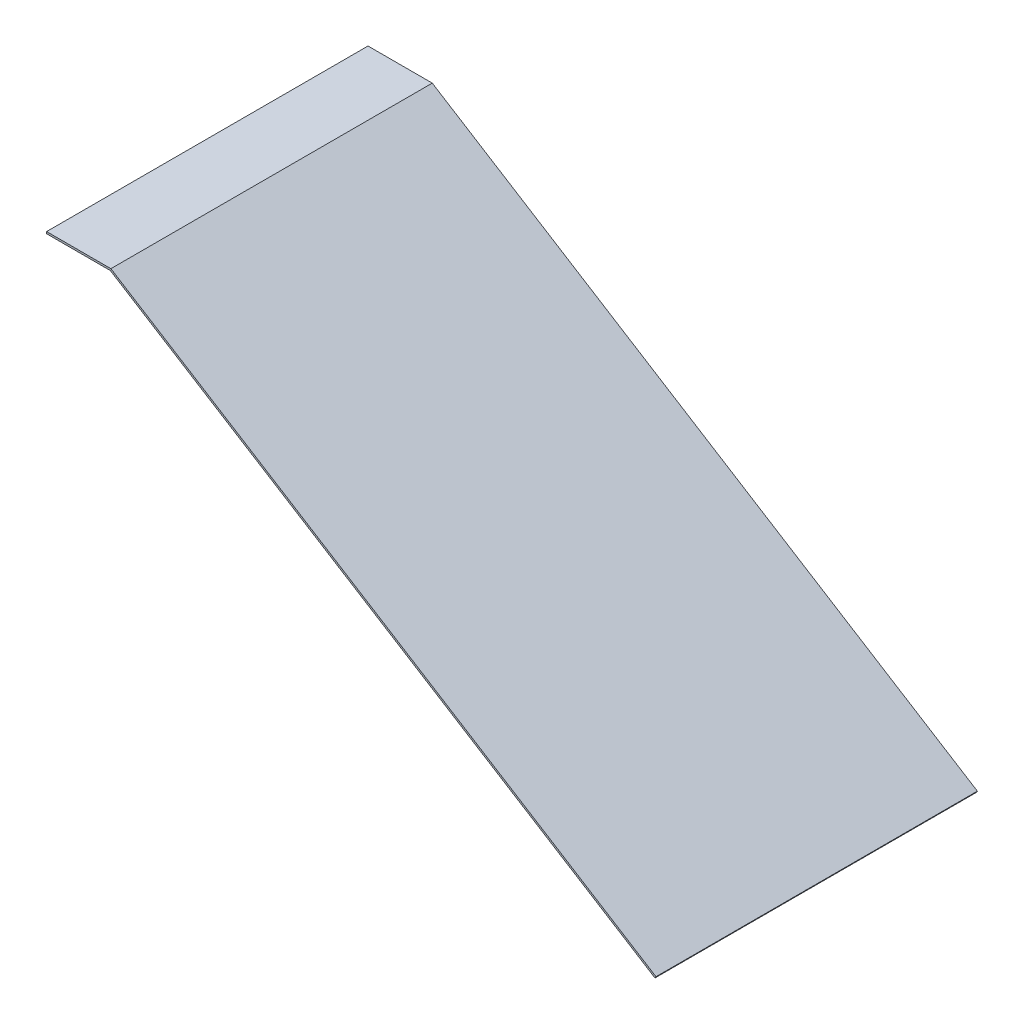
ISO-10303-21;
HEADER;
FILE_DESCRIPTION(('STEP AP214'),'2;1');
FILE_NAME('part.step','',(''),(''),'','','');
FILE_SCHEMA(('AUTOMOTIVE_DESIGN { 1 0 10303 214 1 1 1 1 }'));
ENDSEC;
DATA;
#1=APPLICATION_CONTEXT('core data for automotive mechanical design processes');
#2=APPLICATION_PROTOCOL_DEFINITION('international standard','automotive_design',2000,#1);
#3=PRODUCT_CONTEXT('',#1,'mechanical');
#4=PRODUCT('Part','Part','',(#3));
#5=PRODUCT_RELATED_PRODUCT_CATEGORY('part','',(#4));
#6=PRODUCT_DEFINITION_FORMATION('','',#4);
#7=PRODUCT_DEFINITION_CONTEXT('part definition',#1,'design');
#8=PRODUCT_DEFINITION('design','',#6,#7);
#9=PRODUCT_DEFINITION_SHAPE('','',#8);
#10=(LENGTH_UNIT() NAMED_UNIT(*) SI_UNIT(.MILLI.,.METRE.));
#11=(NAMED_UNIT(*) PLANE_ANGLE_UNIT() SI_UNIT($,.RADIAN.));
#12=(NAMED_UNIT(*) SI_UNIT($,.STERADIAN.) SOLID_ANGLE_UNIT());
#13=UNCERTAINTY_MEASURE_WITH_UNIT(LENGTH_MEASURE(1.E-05),#10,'distance_accuracy_value','');
#14=(GEOMETRIC_REPRESENTATION_CONTEXT(3) GLOBAL_UNCERTAINTY_ASSIGNED_CONTEXT((#13)) GLOBAL_UNIT_ASSIGNED_CONTEXT((#10,
#11,#12)) REPRESENTATION_CONTEXT('',''));
#15=CARTESIAN_POINT('',(0.,0.,0.));
#16=DIRECTION('',(0.,0.,1.));
#17=DIRECTION('',(1.,0.,0.));
#18=AXIS2_PLACEMENT_3D('',#15,#16,#17);
#19=CARTESIAN_POINT('',(50.,559.752128098721,500.));
#20=DIRECTION('',(1.,0.,0.));
#21=DIRECTION('',(0.,0.,-1.));
#22=AXIS2_PLACEMENT_3D('',#19,#20,#21);
#23=PLANE('',#22);
#24=DIRECTION('',(0.,-1.,0.));
#25=VECTOR('',#24,1.);
#26=CARTESIAN_POINT('',(50.,559.752128098721,0.));
#27=LINE('',#26,#25);
#28=CARTESIAN_POINT('',(50.,562.752128098721,0.));
#29=VERTEX_POINT('',#28);
#30=CARTESIAN_POINT('',(50.,559.752128098721,0.));
#31=VERTEX_POINT('',#30);
#32=EDGE_CURVE('E133',#29,#31,#27,.T.);
#33=ORIENTED_EDGE('',*,*,#32,.T.);
#34=DIRECTION('',(0.,0.,-1.));
#35=VECTOR('',#34,1.);
#36=CARTESIAN_POINT('',(50.,559.752128098721,500.));
#37=LINE('',#36,#35);
#38=CARTESIAN_POINT('',(50.,559.752128098721,500.));
#39=VERTEX_POINT('',#38);
#40=EDGE_CURVE('E11',#39,#31,#37,.T.);
#41=ORIENTED_EDGE('',*,*,#40,.F.);
#42=DIRECTION('',(0.,-1.,0.));
#43=VECTOR('',#42,1.);
#44=CARTESIAN_POINT('',(50.,559.752128098721,500.));
#45=LINE('',#44,#43);
#46=CARTESIAN_POINT('',(50.,562.752128098721,500.));
#47=VERTEX_POINT('',#46);
#48=EDGE_CURVE('E145',#47,#39,#45,.T.);
#49=ORIENTED_EDGE('',*,*,#48,.F.);
#50=DIRECTION('',(0.,0.,-1.));
#51=VECTOR('',#50,1.);
#52=CARTESIAN_POINT('',(50.,562.752128098721,500.));
#53=LINE('',#52,#51);
#54=EDGE_CURVE('E129',#47,#29,#53,.T.);
#55=ORIENTED_EDGE('',*,*,#54,.T.);
#56=EDGE_LOOP('',(#33,#41,#49,#55));
#57=FACE_BOUND('',#56,.T.);
#58=ADVANCED_FACE('F43',(#57),#23,.F.);
#59=CARTESIAN_POINT('',(150.,559.752128098721,500.));
#60=DIRECTION('',(0.,1.,0.));
#61=DIRECTION('',(0.,0.,1.));
#62=AXIS2_PLACEMENT_3D('',#59,#60,#61);
#63=PLANE('',#62);
#64=DIRECTION('',(1.,0.,0.));
#65=VECTOR('',#64,1.);
#66=CARTESIAN_POINT('',(150.,559.752128098721,0.));
#67=LINE('',#66,#65);
#68=CARTESIAN_POINT('',(150.,559.752128098721,0.));
#69=VERTEX_POINT('',#68);
#70=EDGE_CURVE('E136',#31,#69,#67,.T.);
#71=ORIENTED_EDGE('',*,*,#70,.T.);
#72=DIRECTION('',(0.,0.,-1.));
#73=VECTOR('',#72,1.);
#74=CARTESIAN_POINT('',(150.,559.752128098721,500.));
#75=LINE('',#74,#73);
#76=CARTESIAN_POINT('',(150.,559.752128098721,500.));
#77=VERTEX_POINT('',#76);
#78=EDGE_CURVE('E51',#77,#69,#75,.T.);
#79=ORIENTED_EDGE('',*,*,#78,.F.);
#80=DIRECTION('',(1.,0.,0.));
#81=VECTOR('',#80,1.);
#82=CARTESIAN_POINT('',(150.,559.752128098721,500.));
#83=LINE('',#82,#81);
#84=EDGE_CURVE('E99',#39,#77,#83,.T.);
#85=ORIENTED_EDGE('',*,*,#84,.F.);
#86=ORIENTED_EDGE('',*,*,#40,.T.);
#87=EDGE_LOOP('',(#71,#79,#85,#86));
#88=FACE_BOUND('',#87,.T.);
#89=ADVANCED_FACE('F170',(#88),#63,.F.);
#90=CARTESIAN_POINT('',(150.,559.214592888635,500.));
#91=DIRECTION('',(1.,0.,0.));
#92=DIRECTION('',(0.,0.,-1.));
#93=AXIS2_PLACEMENT_3D('',#90,#91,#92);
#94=PLANE('',#93);
#95=DIRECTION('',(0.,-1.,0.));
#96=VECTOR('',#95,1.);
#97=CARTESIAN_POINT('',(150.,559.214592888635,0.));
#98=LINE('',#97,#96);
#99=CARTESIAN_POINT('',(150.,559.214592888635,0.));
#100=VERTEX_POINT('',#99);
#101=EDGE_CURVE('E138',#69,#100,#98,.T.);
#102=ORIENTED_EDGE('',*,*,#101,.T.);
#103=DIRECTION('',(0.,0.,-1.));
#104=VECTOR('',#103,1.);
#105=CARTESIAN_POINT('',(150.,559.214592888635,500.));
#106=LINE('',#105,#104);
#107=CARTESIAN_POINT('',(150.,559.214592888635,500.));
#108=VERTEX_POINT('',#107);
#109=EDGE_CURVE('E149',#108,#100,#106,.T.);
#110=ORIENTED_EDGE('',*,*,#109,.F.);
#111=DIRECTION('',(0.,-1.,0.));
#112=VECTOR('',#111,1.);
#113=CARTESIAN_POINT('',(150.,559.214592888635,500.));
#114=LINE('',#113,#112);
#115=EDGE_CURVE('E157',#77,#108,#114,.T.);
#116=ORIENTED_EDGE('',*,*,#115,.F.);
#117=ORIENTED_EDGE('',*,*,#78,.T.);
#118=EDGE_LOOP('',(#102,#110,#116,#117));
#119=FACE_BOUND('',#118,.T.);
#120=ADVANCED_FACE('F155',(#119),#94,.F.);
#121=CARTESIAN_POINT('',(996.458338363726,30.2887195770469,500.));
#122=DIRECTION('',(0.529919264233205,0.848048096156426,0.));
#123=DIRECTION('',(-0.848048096156426,0.529919264233205,0.));
#124=AXIS2_PLACEMENT_3D('',#121,#122,#123);
#125=PLANE('',#124);
#126=DIRECTION('',(0.848048096156426,-0.529919264233205,0.));
#127=VECTOR('',#126,1.);
#128=CARTESIAN_POINT('',(996.458338363726,30.2887195770469,0.));
#129=LINE('',#128,#127);
#130=CARTESIAN_POINT('',(996.458338363726,30.2887195770469,0.));
#131=VERTEX_POINT('',#130);
#132=EDGE_CURVE('E140',#100,#131,#129,.T.);
#133=ORIENTED_EDGE('',*,*,#132,.T.);
#134=DIRECTION('',(0.,0.,-1.));
#135=VECTOR('',#134,1.);
#136=CARTESIAN_POINT('',(996.458338363726,30.2887195770469,500.));
#137=LINE('',#136,#135);
#138=CARTESIAN_POINT('',(996.458338363726,30.2887195770469,500.));
#139=VERTEX_POINT('',#138);
#140=EDGE_CURVE('E124',#139,#131,#137,.T.);
#141=ORIENTED_EDGE('',*,*,#140,.F.);
#142=DIRECTION('',(0.848048096156426,-0.529919264233205,0.));
#143=VECTOR('',#142,1.);
#144=CARTESIAN_POINT('',(996.458338363726,30.2887195770469,500.));
#145=LINE('',#144,#143);
#146=EDGE_CURVE('E115',#108,#139,#145,.T.);
#147=ORIENTED_EDGE('',*,*,#146,.F.);
#148=ORIENTED_EDGE('',*,*,#109,.T.);
#149=EDGE_LOOP('',(#133,#141,#147,#148));
#150=FACE_BOUND('',#149,.T.);
#151=ADVANCED_FACE('F163',(#150),#125,.F.);
#152=CARTESIAN_POINT('',(998.048096156426,32.8328638655162,500.));
#153=DIRECTION('',(-0.848048096156437,0.529919264233188,0.));
#154=DIRECTION('',(-0.529919264233188,-0.848048096156437,0.));
#155=AXIS2_PLACEMENT_3D('',#152,#153,#154);
#156=PLANE('',#155);
#157=DIRECTION('',(0.529919264233188,0.848048096156437,0.));
#158=VECTOR('',#157,1.);
#159=CARTESIAN_POINT('',(998.048096156426,32.8328638655162,0.));
#160=LINE('',#159,#158);
#161=CARTESIAN_POINT('',(998.048096156426,32.8328638655162,0.));
#162=VERTEX_POINT('',#161);
#163=EDGE_CURVE('E123',#131,#162,#160,.T.);
#164=ORIENTED_EDGE('',*,*,#163,.T.);
#165=DIRECTION('',(0.,0.,-1.));
#166=VECTOR('',#165,1.);
#167=CARTESIAN_POINT('',(998.048096156426,32.8328638655162,500.));
#168=LINE('',#167,#166);
#169=CARTESIAN_POINT('',(998.048096156426,32.8328638655162,500.));
#170=VERTEX_POINT('',#169);
#171=EDGE_CURVE('E120',#170,#162,#168,.T.);
#172=ORIENTED_EDGE('',*,*,#171,.F.);
#173=DIRECTION('',(0.529919264233188,0.848048096156437,0.));
#174=VECTOR('',#173,1.);
#175=CARTESIAN_POINT('',(998.048096156426,32.8328638655162,500.));
#176=LINE('',#175,#174);
#177=EDGE_CURVE('E109',#139,#170,#176,.T.);
#178=ORIENTED_EDGE('',*,*,#177,.F.);
#179=ORIENTED_EDGE('',*,*,#140,.T.);
#180=EDGE_LOOP('',(#164,#172,#178,#179));
#181=FACE_BOUND('',#180,.T.);
#182=ADVANCED_FACE('F121',(#181),#156,.F.);
#183=CARTESIAN_POINT('',(150.,562.752128098721,500.));
#184=DIRECTION('',(-0.529919264233205,-0.848048096156426,0.));
#185=DIRECTION('',(0.848048096156426,-0.529919264233205,0.));
#186=AXIS2_PLACEMENT_3D('',#183,#184,#185);
#187=PLANE('',#186);
#188=DIRECTION('',(-0.848048096156426,0.529919264233205,0.));
#189=VECTOR('',#188,1.);
#190=CARTESIAN_POINT('',(150.,562.752128098721,0.));
#191=LINE('',#190,#189);
#192=CARTESIAN_POINT('',(150.,562.752128098721,0.));
#193=VERTEX_POINT('',#192);
#194=EDGE_CURVE('E85',#162,#193,#191,.T.);
#195=ORIENTED_EDGE('',*,*,#194,.T.);
#196=DIRECTION('',(0.,0.,-1.));
#197=VECTOR('',#196,1.);
#198=CARTESIAN_POINT('',(150.,562.752128098721,500.));
#199=LINE('',#198,#197);
#200=CARTESIAN_POINT('',(150.,562.752128098721,500.));
#201=VERTEX_POINT('',#200);
#202=EDGE_CURVE('E125',#201,#193,#199,.T.);
#203=ORIENTED_EDGE('',*,*,#202,.F.);
#204=DIRECTION('',(-0.848048096156426,0.529919264233205,0.));
#205=VECTOR('',#204,1.);
#206=CARTESIAN_POINT('',(150.,562.752128098721,500.));
#207=LINE('',#206,#205);
#208=EDGE_CURVE('E113',#170,#201,#207,.T.);
#209=ORIENTED_EDGE('',*,*,#208,.F.);
#210=ORIENTED_EDGE('',*,*,#171,.T.);
#211=EDGE_LOOP('',(#195,#203,#209,#210));
#212=FACE_BOUND('',#211,.T.);
#213=ADVANCED_FACE('F127',(#212),#187,.F.);
#214=CARTESIAN_POINT('',(50.,562.752128098721,500.));
#215=DIRECTION('',(0.,-1.,0.));
#216=DIRECTION('',(0.,0.,-1.));
#217=AXIS2_PLACEMENT_3D('',#214,#215,#216);
#218=PLANE('',#217);
#219=DIRECTION('',(-1.,0.,0.));
#220=VECTOR('',#219,1.);
#221=CARTESIAN_POINT('',(50.,562.752128098721,0.));
#222=LINE('',#221,#220);
#223=EDGE_CURVE('E91',#193,#29,#222,.T.);
#224=ORIENTED_EDGE('',*,*,#223,.T.);
#225=ORIENTED_EDGE('',*,*,#54,.F.);
#226=DIRECTION('',(-1.,0.,0.));
#227=VECTOR('',#226,1.);
#228=CARTESIAN_POINT('',(50.,562.752128098721,500.));
#229=LINE('',#228,#227);
#230=EDGE_CURVE('E59',#201,#47,#229,.T.);
#231=ORIENTED_EDGE('',*,*,#230,.F.);
#232=ORIENTED_EDGE('',*,*,#202,.T.);
#233=EDGE_LOOP('',(#224,#225,#231,#232));
#234=FACE_BOUND('',#233,.T.);
#235=ADVANCED_FACE('F184',(#234),#218,.F.);
#236=CARTESIAN_POINT('',(0.,0.,500.));
#237=DIRECTION('',(0.,0.,-1.));
#238=DIRECTION('',(-1.,0.,0.));
#239=AXIS2_PLACEMENT_3D('',#236,#237,#238);
#240=PLANE('',#239);
#241=ORIENTED_EDGE('',*,*,#48,.T.);
#242=ORIENTED_EDGE('',*,*,#84,.T.);
#243=ORIENTED_EDGE('',*,*,#115,.T.);
#244=ORIENTED_EDGE('',*,*,#146,.T.);
#245=ORIENTED_EDGE('',*,*,#177,.T.);
#246=ORIENTED_EDGE('',*,*,#208,.T.);
#247=ORIENTED_EDGE('',*,*,#230,.T.);
#248=EDGE_LOOP('',(#241,#242,#243,#244,#245,#246,#247));
#249=FACE_BOUND('',#248,.T.);
#250=ADVANCED_FACE('F111',(#249),#240,.F.);
#251=CARTESIAN_POINT('',(0.,0.,0.));
#252=DIRECTION('',(0.,0.,-1.));
#253=DIRECTION('',(-1.,0.,0.));
#254=AXIS2_PLACEMENT_3D('',#251,#252,#253);
#255=PLANE('',#254);
#256=ORIENTED_EDGE('',*,*,#32,.F.);
#257=ORIENTED_EDGE('',*,*,#223,.F.);
#258=ORIENTED_EDGE('',*,*,#194,.F.);
#259=ORIENTED_EDGE('',*,*,#163,.F.);
#260=ORIENTED_EDGE('',*,*,#132,.F.);
#261=ORIENTED_EDGE('',*,*,#101,.F.);
#262=ORIENTED_EDGE('',*,*,#70,.F.);
#263=EDGE_LOOP('',(#256,#257,#258,#259,#260,#261,#262));
#264=FACE_BOUND('',#263,.T.);
#265=ADVANCED_FACE('F161',(#264),#255,.T.);
#266=CLOSED_SHELL('',(#58,#89,#120,#151,#182,#213,#235,#250,#265));
#267=MANIFOLD_SOLID_BREP('B2',#266);
#268=ADVANCED_BREP_SHAPE_REPRESENTATION('',(#18,#267),#14);
#269=SHAPE_DEFINITION_REPRESENTATION(#9,#268);
ENDSEC;
END-ISO-10303-21;
